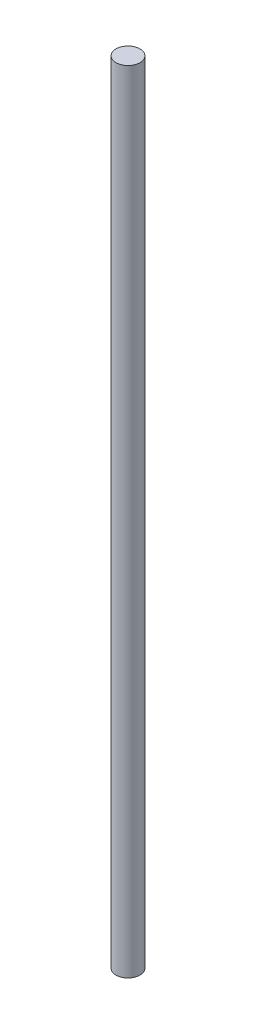
ISO-10303-21;
HEADER;
FILE_DESCRIPTION(('STEP AP214'),'2;1');
FILE_NAME('part.step','',(''),(''),'','','');
FILE_SCHEMA(('AUTOMOTIVE_DESIGN { 1 0 10303 214 1 1 1 1 }'));
ENDSEC;
DATA;
#1=APPLICATION_CONTEXT('core data for automotive mechanical design processes');
#2=APPLICATION_PROTOCOL_DEFINITION('international standard','automotive_design',2000,#1);
#3=PRODUCT_CONTEXT('',#1,'mechanical');
#4=PRODUCT('Part','Part','',(#3));
#5=PRODUCT_RELATED_PRODUCT_CATEGORY('part','',(#4));
#6=PRODUCT_DEFINITION_FORMATION('','',#4);
#7=PRODUCT_DEFINITION_CONTEXT('part definition',#1,'design');
#8=PRODUCT_DEFINITION('design','',#6,#7);
#9=PRODUCT_DEFINITION_SHAPE('','',#8);
#10=(LENGTH_UNIT() NAMED_UNIT(*) SI_UNIT(.MILLI.,.METRE.));
#11=(NAMED_UNIT(*) PLANE_ANGLE_UNIT() SI_UNIT($,.RADIAN.));
#12=(NAMED_UNIT(*) SI_UNIT($,.STERADIAN.) SOLID_ANGLE_UNIT());
#13=UNCERTAINTY_MEASURE_WITH_UNIT(LENGTH_MEASURE(1.E-05),#10,'distance_accuracy_value','');
#14=(GEOMETRIC_REPRESENTATION_CONTEXT(3) GLOBAL_UNCERTAINTY_ASSIGNED_CONTEXT((#13)) GLOBAL_UNIT_ASSIGNED_CONTEXT((#10,
#11,#12)) REPRESENTATION_CONTEXT('',''));
#15=CARTESIAN_POINT('',(0.,0.,0.));
#16=DIRECTION('',(0.,0.,1.));
#17=DIRECTION('',(1.,0.,0.));
#18=AXIS2_PLACEMENT_3D('',#15,#16,#17);
#19=CARTESIAN_POINT('',(0.,264.,0.));
#20=DIRECTION('',(0.,-1.,0.));
#21=DIRECTION('',(0.,0.,-1.));
#22=AXIS2_PLACEMENT_3D('',#19,#20,#21);
#23=CYLINDRICAL_SURFACE('',#22,4.);
#24=CARTESIAN_POINT('',(0.,264.,0.));
#25=DIRECTION('',(0.,1.,0.));
#26=DIRECTION('',(0.,0.,1.));
#27=AXIS2_PLACEMENT_3D('',#24,#25,#26);
#28=CIRCLE('',#27,4.);
#29=CARTESIAN_POINT('',(0.,264.,4.));
#30=VERTEX_POINT('',#29);
#31=EDGE_CURVE('E10',#30,#30,#28,.T.);
#32=ORIENTED_EDGE('',*,*,#31,.F.);
#33=EDGE_LOOP('',(#32));
#34=FACE_BOUND('',#33,.T.);
#35=CARTESIAN_POINT('',(0.,0.,0.));
#36=DIRECTION('',(0.,1.,0.));
#37=DIRECTION('',(0.,0.,1.));
#38=AXIS2_PLACEMENT_3D('',#35,#36,#37);
#39=CIRCLE('',#38,4.);
#40=CARTESIAN_POINT('',(0.,0.,4.));
#41=VERTEX_POINT('',#40);
#42=EDGE_CURVE('E40',#41,#41,#39,.T.);
#43=ORIENTED_EDGE('',*,*,#42,.T.);
#44=EDGE_LOOP('',(#43));
#45=FACE_BOUND('',#44,.T.);
#46=ADVANCED_FACE('F37',(#34,#45),#23,.T.);
#47=CARTESIAN_POINT('',(0.,264.,0.));
#48=DIRECTION('',(0.,1.,0.));
#49=DIRECTION('',(0.,0.,1.));
#50=AXIS2_PLACEMENT_3D('',#47,#48,#49);
#51=PLANE('',#50);
#52=ORIENTED_EDGE('',*,*,#31,.T.);
#53=EDGE_LOOP('',(#52));
#54=FACE_BOUND('',#53,.T.);
#55=ADVANCED_FACE('F54',(#54),#51,.T.);
#56=CARTESIAN_POINT('',(0.,0.,0.));
#57=DIRECTION('',(0.,1.,0.));
#58=DIRECTION('',(0.,0.,1.));
#59=AXIS2_PLACEMENT_3D('',#56,#57,#58);
#60=PLANE('',#59);
#61=ORIENTED_EDGE('',*,*,#42,.F.);
#62=EDGE_LOOP('',(#61));
#63=FACE_BOUND('',#62,.T.);
#64=ADVANCED_FACE('F52',(#63),#60,.F.);
#65=CLOSED_SHELL('',(#46,#55,#64));
#66=MANIFOLD_SOLID_BREP('B2',#65);
#67=ADVANCED_BREP_SHAPE_REPRESENTATION('',(#18,#66),#14);
#68=SHAPE_DEFINITION_REPRESENTATION(#9,#67);
ENDSEC;
END-ISO-10303-21;
